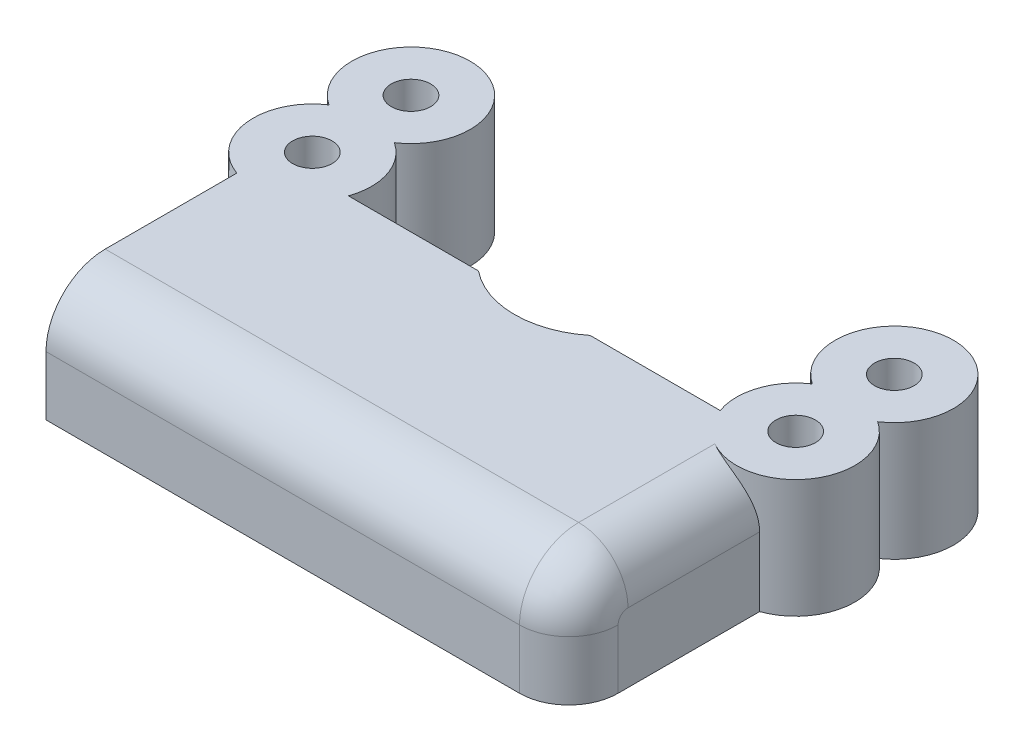
ISO-10303-21;
HEADER;
FILE_DESCRIPTION(('STEP AP214'),'2;1');
FILE_NAME('part.step','',(''),(''),'','','');
FILE_SCHEMA(('AUTOMOTIVE_DESIGN { 1 0 10303 214 1 1 1 1 }'));
ENDSEC;
DATA;
#1=APPLICATION_CONTEXT('core data for automotive mechanical design processes');
#2=APPLICATION_PROTOCOL_DEFINITION('international standard','automotive_design',2000,#1);
#3=PRODUCT_CONTEXT('',#1,'mechanical');
#4=PRODUCT('Part','Part','',(#3));
#5=PRODUCT_RELATED_PRODUCT_CATEGORY('part','',(#4));
#6=PRODUCT_DEFINITION_FORMATION('','',#4);
#7=PRODUCT_DEFINITION_CONTEXT('part definition',#1,'design');
#8=PRODUCT_DEFINITION('design','',#6,#7);
#9=PRODUCT_DEFINITION_SHAPE('','',#8);
#10=(LENGTH_UNIT() NAMED_UNIT(*) SI_UNIT(.MILLI.,.METRE.));
#11=(NAMED_UNIT(*) PLANE_ANGLE_UNIT() SI_UNIT($,.RADIAN.));
#12=(NAMED_UNIT(*) SI_UNIT($,.STERADIAN.) SOLID_ANGLE_UNIT());
#13=UNCERTAINTY_MEASURE_WITH_UNIT(LENGTH_MEASURE(1.E-05),#10,'distance_accuracy_value','');
#14=(GEOMETRIC_REPRESENTATION_CONTEXT(3) GLOBAL_UNCERTAINTY_ASSIGNED_CONTEXT((#13)) GLOBAL_UNIT_ASSIGNED_CONTEXT((#10,
#11,#12)) REPRESENTATION_CONTEXT('',''));
#15=CARTESIAN_POINT('',(0.,0.,0.));
#16=DIRECTION('',(0.,0.,1.));
#17=DIRECTION('',(1.,0.,0.));
#18=AXIS2_PLACEMENT_3D('',#15,#16,#17);
#19=CARTESIAN_POINT('',(-34.8608150974105,12.,-10.4858270670103));
#20=DIRECTION('',(0.,0.,1.));
#21=DIRECTION('',(1.,0.,0.));
#22=AXIS2_PLACEMENT_3D('',#19,#20,#21);
#23=PLANE('',#22);
#24=DIRECTION('',(-1.,0.,0.));
#25=VECTOR('',#24,1.);
#26=CARTESIAN_POINT('',(-34.8608150974105,10.,-10.4858270670103));
#27=LINE('',#26,#25);
#28=CARTESIAN_POINT('',(10.4823306530971,10.,-10.4858270670103));
#29=VERTEX_POINT('',#28);
#30=CARTESIAN_POINT('',(-2.70396084791812,10.,-10.4858270670103));
#31=VERTEX_POINT('',#30);
#32=EDGE_CURVE('E223',#29,#31,#27,.T.);
#33=ORIENTED_EDGE('',*,*,#32,.T.);
#34=DIRECTION('',(0.,1.,0.));
#35=VECTOR('',#34,1.);
#36=CARTESIAN_POINT('',(-2.70396084791812,10.,-10.4858270670103));
#37=LINE('',#36,#35);
#38=CARTESIAN_POINT('',(-2.70396084791812,12.,-10.4858270670103));
#39=VERTEX_POINT('',#38);
#40=EDGE_CURVE('E201',#31,#39,#37,.T.);
#41=ORIENTED_EDGE('',*,*,#40,.T.);
#42=DIRECTION('',(-1.,0.,0.));
#43=VECTOR('',#42,1.);
#44=CARTESIAN_POINT('',(-34.8608150974105,12.,-10.4858270670103));
#45=LINE('',#44,#43);
#46=CARTESIAN_POINT('',(10.4823306530971,12.,-10.4858270670103));
#47=VERTEX_POINT('',#46);
#48=EDGE_CURVE('E235',#47,#39,#45,.T.);
#49=ORIENTED_EDGE('',*,*,#48,.F.);
#50=DIRECTION('',(0.,-1.,0.));
#51=VECTOR('',#50,1.);
#52=CARTESIAN_POINT('',(10.4823306530971,12.,-10.4858270670103));
#53=LINE('',#52,#51);
#54=EDGE_CURVE('E359',#29,#47,#53,.F.);
#55=ORIENTED_EDGE('',*,*,#54,.F.);
#56=EDGE_LOOP('',(#33,#41,#49,#55));
#57=FACE_BOUND('',#56,.T.);
#58=ADVANCED_FACE('F67',(#57),#23,.F.);
#59=CARTESIAN_POINT('',(-14.0176693469029,12.,-10.4858270670103));
#60=VERTEX_POINT('',#59);
#61=CARTESIAN_POINT('',(-27.2039608479181,12.,-10.4858270670103));
#62=VERTEX_POINT('',#61);
#63=EDGE_CURVE('E215',#60,#62,#45,.T.);
#64=ORIENTED_EDGE('',*,*,#63,.F.);
#65=DIRECTION('',(0.,1.,0.));
#66=VECTOR('',#65,1.);
#67=CARTESIAN_POINT('',(-14.0176693469029,10.,-10.4858270670103));
#68=LINE('',#67,#66);
#69=CARTESIAN_POINT('',(-14.0176693469029,10.,-10.4858270670103));
#70=VERTEX_POINT('',#69);
#71=EDGE_CURVE('E198',#60,#70,#68,.F.);
#72=ORIENTED_EDGE('',*,*,#71,.T.);
#73=CARTESIAN_POINT('',(-27.2039608479181,10.,-10.4858270670103));
#74=VERTEX_POINT('',#73);
#75=EDGE_CURVE('E213',#70,#74,#27,.T.);
#76=ORIENTED_EDGE('',*,*,#75,.T.);
#77=DIRECTION('',(0.,-1.,0.));
#78=VECTOR('',#77,1.);
#79=CARTESIAN_POINT('',(-27.2039608479181,12.,-10.4858270670103));
#80=LINE('',#79,#78);
#81=EDGE_CURVE('E386',#62,#74,#80,.T.);
#82=ORIENTED_EDGE('',*,*,#81,.F.);
#83=EDGE_LOOP('',(#64,#72,#76,#82));
#84=FACE_BOUND('',#83,.T.);
#85=ADVANCED_FACE('F211',(#84),#23,.F.);
#86=CARTESIAN_POINT('',(18.1391849025895,12.,12.5141729329897));
#87=DIRECTION('',(-1.,0.,0.));
#88=DIRECTION('',(0.,0.,1.));
#89=AXIS2_PLACEMENT_3D('',#86,#87,#88);
#90=PLANE('',#89);
#91=CARTESIAN_POINT('',(18.1391849025895,6.,6.5141729329897));
#92=DIRECTION('',(-1.,0.,0.));
#93=DIRECTION('',(0.,0.,1.));
#94=AXIS2_PLACEMENT_3D('',#91,#92,#93);
#95=CIRCLE('',#94,1.);
#96=CARTESIAN_POINT('',(18.1391849025895,7.,6.5141729329897));
#97=VERTEX_POINT('',#96);
#98=CARTESIAN_POINT('',(18.1391849025895,6.,7.5141729329897));
#99=VERTEX_POINT('',#98);
#100=EDGE_CURVE('E263',#97,#99,#95,.F.);
#101=ORIENTED_EDGE('',*,*,#100,.T.);
#102=DIRECTION('',(0.,-1.,0.));
#103=VECTOR('',#102,1.);
#104=CARTESIAN_POINT('',(18.1391849025895,12.,7.5141729329897));
#105=LINE('',#104,#103);
#106=CARTESIAN_POINT('',(18.1391849025895,0.,7.5141729329897));
#107=VERTEX_POINT('',#106);
#108=EDGE_CURVE('E265',#99,#107,#105,.T.);
#109=ORIENTED_EDGE('',*,*,#108,.T.);
#110=DIRECTION('',(0.,0.,1.));
#111=VECTOR('',#110,1.);
#112=CARTESIAN_POINT('',(18.1391849025895,0.,0.));
#113=LINE('',#112,#111);
#114=CARTESIAN_POINT('',(18.1391849025895,0.,-6.82897281751792));
#115=VERTEX_POINT('',#114);
#116=EDGE_CURVE('E417',#115,#107,#113,.T.);
#117=ORIENTED_EDGE('',*,*,#116,.F.);
#118=DIRECTION('',(0.,-1.,0.));
#119=VECTOR('',#118,1.);
#120=CARTESIAN_POINT('',(18.1391849025895,10.,-6.82897281751792));
#121=LINE('',#120,#119);
#122=CARTESIAN_POINT('',(18.1391849025895,7.,-6.82897281751792));
#123=VERTEX_POINT('',#122);
#124=EDGE_CURVE('E433',#123,#115,#121,.T.);
#125=ORIENTED_EDGE('',*,*,#124,.F.);
#126=DIRECTION('',(0.,0.,-1.));
#127=VECTOR('',#126,1.);
#128=CARTESIAN_POINT('',(18.1391849025895,7.,12.5141729329897));
#129=LINE('',#128,#127);
#130=EDGE_CURVE('E206',#123,#97,#129,.F.);
#131=ORIENTED_EDGE('',*,*,#130,.T.);
#132=EDGE_LOOP('',(#101,#109,#117,#125,#131));
#133=FACE_BOUND('',#132,.T.);
#134=ADVANCED_FACE('F307',(#133),#90,.F.);
#135=CARTESIAN_POINT('',(-34.8608150974105,12.,12.5141729329897));
#136=DIRECTION('',(1.,0.,0.));
#137=DIRECTION('',(0.,0.,-1.));
#138=AXIS2_PLACEMENT_3D('',#135,#136,#137);
#139=PLANE('',#138);
#140=DIRECTION('',(0.,-1.,0.));
#141=VECTOR('',#140,1.);
#142=CARTESIAN_POINT('',(-34.8608150974105,12.,-6.82897281751793));
#143=LINE('',#142,#141);
#144=CARTESIAN_POINT('',(-34.8608150974105,10.,-6.82897281751793));
#145=VERTEX_POINT('',#144);
#146=CARTESIAN_POINT('',(-34.8608150974105,12.,-6.82897281751793));
#147=VERTEX_POINT('',#146);
#148=EDGE_CURVE('E390',#145,#147,#143,.F.);
#149=ORIENTED_EDGE('',*,*,#148,.F.);
#150=DIRECTION('',(0.,0.,1.));
#151=VECTOR('',#150,1.);
#152=CARTESIAN_POINT('',(-34.8608150974105,10.,12.5141729329897));
#153=LINE('',#152,#151);
#154=CARTESIAN_POINT('',(-34.8608150974105,10.,7.54581557448832));
#155=VERTEX_POINT('',#154);
#156=EDGE_CURVE('E224',#145,#155,#153,.T.);
#157=ORIENTED_EDGE('',*,*,#156,.T.);
#158=DIRECTION('',(0.,-1.,0.));
#159=VECTOR('',#158,1.);
#160=CARTESIAN_POINT('',(-34.8608150974105,10.,7.54581557448832));
#161=LINE('',#160,#159);
#162=CARTESIAN_POINT('',(-34.8608150974105,0.,7.54581557448832));
#163=VERTEX_POINT('',#162);
#164=EDGE_CURVE('E375',#155,#163,#161,.T.);
#165=ORIENTED_EDGE('',*,*,#164,.T.);
#166=DIRECTION('',(0.,0.,1.));
#167=VECTOR('',#166,1.);
#168=CARTESIAN_POINT('',(-34.8608150974105,0.,0.));
#169=LINE('',#168,#167);
#170=CARTESIAN_POINT('',(-34.8608150974105,0.,12.5141729329897));
#171=VERTEX_POINT('',#170);
#172=EDGE_CURVE('E411',#163,#171,#169,.T.);
#173=ORIENTED_EDGE('',*,*,#172,.T.);
#174=DIRECTION('',(0.,-1.,0.));
#175=VECTOR('',#174,1.);
#176=CARTESIAN_POINT('',(-34.8608150974105,12.,12.5141729329897));
#177=LINE('',#176,#175);
#178=CARTESIAN_POINT('',(-34.8608150974105,6.,12.5141729329897));
#179=VERTEX_POINT('',#178);
#180=EDGE_CURVE('E232',#179,#171,#177,.T.);
#181=ORIENTED_EDGE('',*,*,#180,.F.);
#182=CARTESIAN_POINT('',(-34.8608150974105,6.,6.5141729329897));
#183=DIRECTION('',(1.,0.,0.));
#184=DIRECTION('',(0.,0.,-1.));
#185=AXIS2_PLACEMENT_3D('',#182,#183,#184);
#186=CIRCLE('',#185,6.);
#187=CARTESIAN_POINT('',(-34.8608150974105,12.,6.5141729329897));
#188=VERTEX_POINT('',#187);
#189=EDGE_CURVE('E207',#179,#188,#186,.F.);
#190=ORIENTED_EDGE('',*,*,#189,.T.);
#191=DIRECTION('',(0.,0.,1.));
#192=VECTOR('',#191,1.);
#193=CARTESIAN_POINT('',(-34.8608150974105,12.,12.5141729329897));
#194=LINE('',#193,#192);
#195=EDGE_CURVE('E226',#147,#188,#194,.T.);
#196=ORIENTED_EDGE('',*,*,#195,.F.);
#197=EDGE_LOOP('',(#149,#157,#165,#173,#181,#190,#196));
#198=FACE_BOUND('',#197,.T.);
#199=ADVANCED_FACE('F310',(#198),#139,.F.);
#200=CARTESIAN_POINT('',(-32.8608150974105,10.,-22.4858270670103));
#201=DIRECTION('',(0.,-1.,0.));
#202=DIRECTION('',(0.,0.,-1.));
#203=AXIS2_PLACEMENT_3D('',#200,#201,#202);
#204=CYLINDRICAL_SURFACE('',#203,6.);
#205=CARTESIAN_POINT('',(-32.8608150974105,0.,-22.4858270670103));
#206=DIRECTION('',(0.,1.,0.));
#207=DIRECTION('',(0.,0.,1.));
#208=AXIS2_PLACEMENT_3D('',#205,#206,#207);
#209=CIRCLE('',#208,6.);
#210=CARTESIAN_POINT('',(-29.5441903070551,0.,-17.4858270670103));
#211=VERTEX_POINT('',#210);
#212=CARTESIAN_POINT('',(-36.1774398877659,0.,-17.4858270670103));
#213=VERTEX_POINT('',#212);
#214=EDGE_CURVE('E234',#211,#213,#209,.T.);
#215=ORIENTED_EDGE('',*,*,#214,.T.);
#216=DIRECTION('',(0.,-1.,0.));
#217=VECTOR('',#216,1.);
#218=CARTESIAN_POINT('',(-36.1774398877659,10.,-17.4858270670103));
#219=LINE('',#218,#217);
#220=CARTESIAN_POINT('',(-36.1774398877659,12.,-17.4858270670103));
#221=VERTEX_POINT('',#220);
#222=EDGE_CURVE('E250',#221,#213,#219,.T.);
#223=ORIENTED_EDGE('',*,*,#222,.F.);
#224=CARTESIAN_POINT('',(-32.8608150974105,12.,-22.4858270670103));
#225=DIRECTION('',(0.,1.,0.));
#226=DIRECTION('',(0.,0.,1.));
#227=AXIS2_PLACEMENT_3D('',#224,#225,#226);
#228=CIRCLE('',#227,6.);
#229=CARTESIAN_POINT('',(-29.5441903070551,12.,-17.4858270670103));
#230=VERTEX_POINT('',#229);
#231=EDGE_CURVE('E388',#230,#221,#228,.T.);
#232=ORIENTED_EDGE('',*,*,#231,.F.);
#233=DIRECTION('',(0.,-1.,0.));
#234=VECTOR('',#233,1.);
#235=CARTESIAN_POINT('',(-29.5441903070551,10.,-17.4858270670103));
#236=LINE('',#235,#234);
#237=EDGE_CURVE('E237',#230,#211,#236,.T.);
#238=ORIENTED_EDGE('',*,*,#237,.T.);
#239=EDGE_LOOP('',(#215,#223,#232,#238));
#240=FACE_BOUND('',#239,.T.);
#241=ADVANCED_FACE('F318',(#240),#204,.T.);
#242=CARTESIAN_POINT('',(-32.8608150974105,10.,-22.4858270670103));
#243=DIRECTION('',(0.,-1.,0.));
#244=DIRECTION('',(0.,0.,-1.));
#245=AXIS2_PLACEMENT_3D('',#242,#243,#244);
#246=CYLINDRICAL_SURFACE('',#245,2.);
#247=CARTESIAN_POINT('',(-32.8608150974105,0.,-22.4858270670103));
#248=DIRECTION('',(0.,1.,0.));
#249=DIRECTION('',(0.,0.,1.));
#250=AXIS2_PLACEMENT_3D('',#247,#248,#249);
#251=CIRCLE('',#250,2.);
#252=CARTESIAN_POINT('',(-32.8608150974105,0.,-20.4858270670103));
#253=VERTEX_POINT('',#252);
#254=EDGE_CURVE('E243',#253,#253,#251,.T.);
#255=ORIENTED_EDGE('',*,*,#254,.F.);
#256=EDGE_LOOP('',(#255));
#257=FACE_BOUND('',#256,.T.);
#258=CARTESIAN_POINT('',(-32.8608150974105,12.,-22.4858270670103));
#259=DIRECTION('',(0.,1.,0.));
#260=DIRECTION('',(0.,0.,1.));
#261=AXIS2_PLACEMENT_3D('',#258,#259,#260);
#262=CIRCLE('',#261,2.00000000000001);
#263=CARTESIAN_POINT('',(-32.8608150974105,12.,-20.4858270670103));
#264=VERTEX_POINT('',#263);
#265=EDGE_CURVE('E395',#264,#264,#262,.T.);
#266=ORIENTED_EDGE('',*,*,#265,.T.);
#267=EDGE_LOOP('',(#266));
#268=FACE_BOUND('',#267,.T.);
#269=ADVANCED_FACE('F328',(#257,#268),#246,.F.);
#270=CARTESIAN_POINT('',(-32.8608150974105,10.,-12.4858270670103));
#271=DIRECTION('',(0.,-1.,0.));
#272=DIRECTION('',(0.,0.,-1.));
#273=AXIS2_PLACEMENT_3D('',#270,#271,#272);
#274=CYLINDRICAL_SURFACE('',#273,6.);
#275=CARTESIAN_POINT('',(-32.8608150974105,0.,-12.4858270670103));
#276=DIRECTION('',(0.,1.,0.));
#277=DIRECTION('',(0.,0.,1.));
#278=AXIS2_PLACEMENT_3D('',#275,#276,#277);
#279=CIRCLE('',#278,6.);
#280=EDGE_CURVE('E241',#213,#211,#279,.T.);
#281=ORIENTED_EDGE('',*,*,#280,.T.);
#282=ORIENTED_EDGE('',*,*,#237,.F.);
#283=CARTESIAN_POINT('',(-32.8608150974105,12.,-12.4858270670103));
#284=DIRECTION('',(0.,1.,0.));
#285=DIRECTION('',(0.,0.,1.));
#286=AXIS2_PLACEMENT_3D('',#283,#284,#285);
#287=CIRCLE('',#286,5.99999999999999);
#288=EDGE_CURVE('E384',#62,#230,#287,.T.);
#289=ORIENTED_EDGE('',*,*,#288,.F.);
#290=ORIENTED_EDGE('',*,*,#81,.T.);
#291=CARTESIAN_POINT('',(-32.8608150974105,10.,-12.4858270670103));
#292=DIRECTION('',(0.,1.,0.));
#293=DIRECTION('',(0.,0.,1.));
#294=AXIS2_PLACEMENT_3D('',#291,#292,#293);
#295=CIRCLE('',#294,6.);
#296=EDGE_CURVE('E222',#145,#74,#295,.T.);
#297=ORIENTED_EDGE('',*,*,#296,.F.);
#298=ORIENTED_EDGE('',*,*,#148,.T.);
#299=EDGE_CURVE('E387',#221,#147,#287,.T.);
#300=ORIENTED_EDGE('',*,*,#299,.F.);
#301=ORIENTED_EDGE('',*,*,#222,.T.);
#302=EDGE_LOOP('',(#281,#282,#289,#290,#297,#298,#300,#301));
#303=FACE_BOUND('',#302,.T.);
#304=ADVANCED_FACE('F326',(#303),#274,.T.);
#305=CARTESIAN_POINT('',(-32.8608150974105,10.,-12.4858270670103));
#306=DIRECTION('',(0.,-1.,0.));
#307=DIRECTION('',(0.,0.,-1.));
#308=AXIS2_PLACEMENT_3D('',#305,#306,#307);
#309=CYLINDRICAL_SURFACE('',#308,2.);
#310=CARTESIAN_POINT('',(-32.8608150974105,0.,-12.4858270670103));
#311=DIRECTION('',(0.,1.,0.));
#312=DIRECTION('',(0.,0.,1.));
#313=AXIS2_PLACEMENT_3D('',#310,#311,#312);
#314=CIRCLE('',#313,2.);
#315=CARTESIAN_POINT('',(-32.8608150974105,0.,-10.4858270670103));
#316=VERTEX_POINT('',#315);
#317=EDGE_CURVE('E238',#316,#316,#314,.T.);
#318=ORIENTED_EDGE('',*,*,#317,.F.);
#319=EDGE_LOOP('',(#318));
#320=FACE_BOUND('',#319,.T.);
#321=CARTESIAN_POINT('',(-32.8608150974105,12.,-12.4858270670103));
#322=DIRECTION('',(0.,1.,0.));
#323=DIRECTION('',(0.,0.,1.));
#324=AXIS2_PLACEMENT_3D('',#321,#322,#323);
#325=CIRCLE('',#324,2.);
#326=CARTESIAN_POINT('',(-32.8608150974105,12.,-10.4858270670103));
#327=VERTEX_POINT('',#326);
#328=EDGE_CURVE('E391',#327,#327,#325,.T.);
#329=ORIENTED_EDGE('',*,*,#328,.T.);
#330=EDGE_LOOP('',(#329));
#331=FACE_BOUND('',#330,.T.);
#332=ADVANCED_FACE('F322',(#320,#331),#309,.F.);
#333=CARTESIAN_POINT('',(0.,0.,0.));
#334=DIRECTION('',(0.,1.,0.));
#335=DIRECTION('',(0.,0.,1.));
#336=AXIS2_PLACEMENT_3D('',#333,#334,#335);
#337=PLANE('',#336);
#338=ORIENTED_EDGE('',*,*,#214,.F.);
#339=ORIENTED_EDGE('',*,*,#280,.F.);
#340=EDGE_LOOP('',(#338,#339));
#341=FACE_BOUND('',#340,.T.);
#342=ORIENTED_EDGE('',*,*,#254,.T.);
#343=EDGE_LOOP('',(#342));
#344=FACE_BOUND('',#343,.T.);
#345=ORIENTED_EDGE('',*,*,#317,.T.);
#346=EDGE_LOOP('',(#345));
#347=FACE_BOUND('',#346,.T.);
#348=ADVANCED_FACE('F314',(#341,#344,#347),#337,.F.);
#349=CARTESIAN_POINT('',(-34.8608150974105,12.,12.5141729329897));
#350=DIRECTION('',(0.,0.,-1.));
#351=DIRECTION('',(-1.,0.,0.));
#352=AXIS2_PLACEMENT_3D('',#349,#350,#351);
#353=PLANE('',#352);
#354=DIRECTION('',(1.,0.,0.));
#355=VECTOR('',#354,1.);
#356=CARTESIAN_POINT('',(0.,0.,12.5141729329897));
#357=LINE('',#356,#355);
#358=CARTESIAN_POINT('',(13.1391849025895,0.,12.5141729329897));
#359=VERTEX_POINT('',#358);
#360=EDGE_CURVE('E414',#171,#359,#357,.T.);
#361=ORIENTED_EDGE('',*,*,#360,.T.);
#362=DIRECTION('',(0.,-1.,0.));
#363=VECTOR('',#362,1.);
#364=CARTESIAN_POINT('',(13.1391849025895,12.,12.5141729329897));
#365=LINE('',#364,#363);
#366=CARTESIAN_POINT('',(13.1391849025895,6.,12.5141729329897));
#367=VERTEX_POINT('',#366);
#368=EDGE_CURVE('E270',#359,#367,#365,.F.);
#369=ORIENTED_EDGE('',*,*,#368,.T.);
#370=DIRECTION('',(1.,0.,0.));
#371=VECTOR('',#370,1.);
#372=CARTESIAN_POINT('',(-34.8608150974105,6.,12.5141729329897));
#373=LINE('',#372,#371);
#374=EDGE_CURVE('E258',#367,#179,#373,.F.);
#375=ORIENTED_EDGE('',*,*,#374,.T.);
#376=ORIENTED_EDGE('',*,*,#180,.T.);
#377=EDGE_LOOP('',(#361,#369,#375,#376));
#378=FACE_BOUND('',#377,.T.);
#379=ADVANCED_FACE('F301',(#378),#353,.F.);
#380=CARTESIAN_POINT('',(0.,12.,0.));
#381=DIRECTION('',(0.,-1.,0.));
#382=DIRECTION('',(0.,0.,-1.));
#383=AXIS2_PLACEMENT_3D('',#380,#381,#382);
#384=PLANE('',#383);
#385=CARTESIAN_POINT('',(16.1391849025895,12.,-12.4858270670103));
#386=DIRECTION('',(0.,1.,0.));
#387=DIRECTION('',(0.,0.,1.));
#388=AXIS2_PLACEMENT_3D('',#385,#386,#387);
#389=CIRCLE('',#388,2.);
#390=CARTESIAN_POINT('',(16.1391849025895,12.,-10.4858270670103));
#391=VERTEX_POINT('',#390);
#392=EDGE_CURVE('E450',#391,#391,#389,.F.);
#393=ORIENTED_EDGE('',*,*,#392,.T.);
#394=EDGE_LOOP('',(#393));
#395=FACE_BOUND('',#394,.T.);
#396=DIRECTION('',(1.,0.,0.));
#397=VECTOR('',#396,1.);
#398=CARTESIAN_POINT('',(0.,12.,6.5141729329897));
#399=LINE('',#398,#397);
#400=CARTESIAN_POINT('',(13.1391849025895,12.,6.5141729329897));
#401=VERTEX_POINT('',#400);
#402=EDGE_CURVE('E256',#188,#401,#399,.T.);
#403=ORIENTED_EDGE('',*,*,#402,.T.);
#404=DIRECTION('',(0.,0.,-1.));
#405=VECTOR('',#404,1.);
#406=CARTESIAN_POINT('',(13.1391849025895,12.,0.));
#407=LINE('',#406,#405);
#408=CARTESIAN_POINT('',(13.1391849025895,12.,-7.28967464430367));
#409=VERTEX_POINT('',#408);
#410=EDGE_CURVE('E77',#401,#409,#407,.T.);
#411=ORIENTED_EDGE('',*,*,#410,.T.);
#412=CARTESIAN_POINT('',(16.1391849025895,12.,-12.4858270670103));
#413=DIRECTION('',(0.,1.,0.));
#414=DIRECTION('',(0.,0.,1.));
#415=AXIS2_PLACEMENT_3D('',#412,#413,#414);
#416=CIRCLE('',#415,6.);
#417=CARTESIAN_POINT('',(19.4558096929449,12.,-17.4858270670103));
#418=VERTEX_POINT('',#417);
#419=EDGE_CURVE('E84',#409,#418,#416,.T.);
#420=ORIENTED_EDGE('',*,*,#419,.T.);
#421=CARTESIAN_POINT('',(16.1391849025895,12.,-22.4858270670103));
#422=DIRECTION('',(0.,1.,0.));
#423=DIRECTION('',(0.,0.,1.));
#424=AXIS2_PLACEMENT_3D('',#421,#422,#423);
#425=CIRCLE('',#424,6.);
#426=CARTESIAN_POINT('',(12.8225601122341,12.,-17.4858270670103));
#427=VERTEX_POINT('',#426);
#428=EDGE_CURVE('E449',#418,#427,#425,.T.);
#429=ORIENTED_EDGE('',*,*,#428,.T.);
#430=EDGE_CURVE('E445',#427,#47,#416,.T.);
#431=ORIENTED_EDGE('',*,*,#430,.T.);
#432=ORIENTED_EDGE('',*,*,#48,.T.);
#433=CARTESIAN_POINT('',(-8.36081509741049,12.,-17.4858270670103));
#434=DIRECTION('',(0.,1.,0.));
#435=DIRECTION('',(0.,0.,1.));
#436=AXIS2_PLACEMENT_3D('',#433,#434,#435);
#437=CIRCLE('',#436,9.);
#438=EDGE_CURVE('E216',#60,#39,#437,.T.);
#439=ORIENTED_EDGE('',*,*,#438,.F.);
#440=ORIENTED_EDGE('',*,*,#63,.T.);
#441=ORIENTED_EDGE('',*,*,#288,.T.);
#442=ORIENTED_EDGE('',*,*,#231,.T.);
#443=ORIENTED_EDGE('',*,*,#299,.T.);
#444=ORIENTED_EDGE('',*,*,#195,.T.);
#445=EDGE_LOOP('',(#403,#411,#420,#429,#431,#432,#439,#440,#441,#442,#443,#444));
#446=FACE_BOUND('',#445,.T.);
#447=ORIENTED_EDGE('',*,*,#265,.F.);
#448=EDGE_LOOP('',(#447));
#449=FACE_BOUND('',#448,.T.);
#450=ORIENTED_EDGE('',*,*,#328,.F.);
#451=EDGE_LOOP('',(#450));
#452=FACE_BOUND('',#451,.T.);
#453=CARTESIAN_POINT('',(16.1391849025895,12.,-22.4858270670103));
#454=DIRECTION('',(0.,1.,0.));
#455=DIRECTION('',(0.,0.,1.));
#456=AXIS2_PLACEMENT_3D('',#453,#454,#455);
#457=CIRCLE('',#456,2.);
#458=CARTESIAN_POINT('',(16.1391849025895,12.,-20.4858270670103));
#459=VERTEX_POINT('',#458);
#460=EDGE_CURVE('E447',#459,#459,#457,.F.);
#461=ORIENTED_EDGE('',*,*,#460,.T.);
#462=EDGE_LOOP('',(#461));
#463=FACE_BOUND('',#462,.T.);
#464=ADVANCED_FACE('F298',(#395,#446,#449,#452,#463),#384,.F.);
#465=CARTESIAN_POINT('',(0.,10.,0.));
#466=DIRECTION('',(0.,-1.,0.));
#467=DIRECTION('',(0.,0.,-1.));
#468=AXIS2_PLACEMENT_3D('',#465,#466,#467);
#469=PLANE('',#468);
#470=CARTESIAN_POINT('',(-8.36081509741049,10.,-17.4858270670103));
#471=DIRECTION('',(0.,-1.,0.));
#472=DIRECTION('',(0.,0.,-1.));
#473=AXIS2_PLACEMENT_3D('',#470,#471,#472);
#474=CIRCLE('',#473,9.);
#475=EDGE_CURVE('E195',#31,#70,#474,.T.);
#476=ORIENTED_EDGE('',*,*,#475,.F.);
#477=ORIENTED_EDGE('',*,*,#32,.F.);
#478=CARTESIAN_POINT('',(16.1391849025895,10.,-12.4858270670103));
#479=DIRECTION('',(0.,-1.,0.));
#480=DIRECTION('',(0.,0.,-1.));
#481=AXIS2_PLACEMENT_3D('',#478,#479,#480);
#482=CIRCLE('',#481,6.);
#483=CARTESIAN_POINT('',(14.1391849025895,10.,-6.82897281751792));
#484=VERTEX_POINT('',#483);
#485=EDGE_CURVE('E253',#29,#484,#482,.F.);
#486=ORIENTED_EDGE('',*,*,#485,.T.);
#487=DIRECTION('',(0.,0.,1.));
#488=VECTOR('',#487,1.);
#489=CARTESIAN_POINT('',(14.1391849025895,10.,0.));
#490=LINE('',#489,#488);
#491=CARTESIAN_POINT('',(14.1391849025895,10.,7.5458155744883));
#492=VERTEX_POINT('',#491);
#493=EDGE_CURVE('E363',#484,#492,#490,.T.);
#494=ORIENTED_EDGE('',*,*,#493,.T.);
#495=DIRECTION('',(1.,0.,0.));
#496=VECTOR('',#495,1.);
#497=CARTESIAN_POINT('',(0.,10.,7.54581557448831));
#498=LINE('',#497,#496);
#499=EDGE_CURVE('E400',#155,#492,#498,.T.);
#500=ORIENTED_EDGE('',*,*,#499,.F.);
#501=ORIENTED_EDGE('',*,*,#156,.F.);
#502=ORIENTED_EDGE('',*,*,#296,.T.);
#503=ORIENTED_EDGE('',*,*,#75,.F.);
#504=EDGE_LOOP('',(#476,#477,#486,#494,#500,#501,#502,#503));
#505=FACE_BOUND('',#504,.T.);
#506=ADVANCED_FACE('F219',(#505),#469,.T.);
#507=CARTESIAN_POINT('',(16.1391849025895,10.,-12.4858270670103));
#508=DIRECTION('',(0.,-1.,0.));
#509=DIRECTION('',(0.,0.,-1.));
#510=AXIS2_PLACEMENT_3D('',#507,#508,#509);
#511=CYLINDRICAL_SURFACE('',#510,6.);
#512=CARTESIAN_POINT('',(16.1391849025895,0.,-12.4858270670103));
#513=DIRECTION('',(0.,1.,0.));
#514=DIRECTION('',(0.,0.,1.));
#515=AXIS2_PLACEMENT_3D('',#512,#513,#514);
#516=CIRCLE('',#515,6.);
#517=CARTESIAN_POINT('',(12.8225601122341,0.,-17.4858270670103));
#518=VERTEX_POINT('',#517);
#519=CARTESIAN_POINT('',(14.1391849025895,0.,-6.82897281751792));
#520=VERTEX_POINT('',#519);
#521=EDGE_CURVE('E371',#518,#520,#516,.T.);
#522=ORIENTED_EDGE('',*,*,#521,.T.);
#523=DIRECTION('',(0.,-1.,0.));
#524=VECTOR('',#523,1.);
#525=CARTESIAN_POINT('',(14.1391849025895,10.,-6.82897281751792));
#526=LINE('',#525,#524);
#527=EDGE_CURVE('E228',#484,#520,#526,.T.);
#528=ORIENTED_EDGE('',*,*,#527,.F.);
#529=ORIENTED_EDGE('',*,*,#485,.F.);
#530=ORIENTED_EDGE('',*,*,#54,.T.);
#531=ORIENTED_EDGE('',*,*,#430,.F.);
#532=DIRECTION('',(0.,-1.,0.));
#533=VECTOR('',#532,1.);
#534=CARTESIAN_POINT('',(12.8225601122341,10.,-17.4858270670103));
#535=LINE('',#534,#533);
#536=EDGE_CURVE('E404',#427,#518,#535,.T.);
#537=ORIENTED_EDGE('',*,*,#536,.T.);
#538=EDGE_LOOP('',(#522,#528,#529,#530,#531,#537));
#539=FACE_BOUND('',#538,.T.);
#540=ADVANCED_FACE('F293',(#539),#511,.T.);
#541=CARTESIAN_POINT('',(14.1391849025895,10.,0.));
#542=DIRECTION('',(1.,0.,0.));
#543=DIRECTION('',(0.,0.,-1.));
#544=AXIS2_PLACEMENT_3D('',#541,#542,#543);
#545=PLANE('',#544);
#546=DIRECTION('',(0.,0.,1.));
#547=VECTOR('',#546,1.);
#548=CARTESIAN_POINT('',(14.1391849025895,0.,0.));
#549=LINE('',#548,#547);
#550=CARTESIAN_POINT('',(14.1391849025895,0.,7.5458155744883));
#551=VERTEX_POINT('',#550);
#552=EDGE_CURVE('E406',#520,#551,#549,.T.);
#553=ORIENTED_EDGE('',*,*,#552,.T.);
#554=DIRECTION('',(0.,-1.,0.));
#555=VECTOR('',#554,1.);
#556=CARTESIAN_POINT('',(14.1391849025895,10.,7.5458155744883));
#557=LINE('',#556,#555);
#558=EDGE_CURVE('E373',#492,#551,#557,.T.);
#559=ORIENTED_EDGE('',*,*,#558,.F.);
#560=ORIENTED_EDGE('',*,*,#493,.F.);
#561=ORIENTED_EDGE('',*,*,#527,.T.);
#562=EDGE_LOOP('',(#553,#559,#560,#561));
#563=FACE_BOUND('',#562,.T.);
#564=ADVANCED_FACE('F289',(#563),#545,.F.);
#565=CARTESIAN_POINT('',(0.,10.,7.54581557448831));
#566=DIRECTION('',(0.,0.,-1.));
#567=DIRECTION('',(-1.,0.,0.));
#568=AXIS2_PLACEMENT_3D('',#565,#566,#567);
#569=PLANE('',#568);
#570=DIRECTION('',(1.,0.,0.));
#571=VECTOR('',#570,1.);
#572=CARTESIAN_POINT('',(0.,0.,7.54581557448831));
#573=LINE('',#572,#571);
#574=EDGE_CURVE('E408',#163,#551,#573,.T.);
#575=ORIENTED_EDGE('',*,*,#574,.F.);
#576=ORIENTED_EDGE('',*,*,#164,.F.);
#577=ORIENTED_EDGE('',*,*,#499,.T.);
#578=ORIENTED_EDGE('',*,*,#558,.T.);
#579=EDGE_LOOP('',(#575,#576,#577,#578));
#580=FACE_BOUND('',#579,.T.);
#581=ADVANCED_FACE('F284',(#580),#569,.T.);
#582=CARTESIAN_POINT('',(16.1391849025895,10.,-12.4858270670103));
#583=DIRECTION('',(0.,-1.,0.));
#584=DIRECTION('',(0.,0.,-1.));
#585=AXIS2_PLACEMENT_3D('',#582,#583,#584);
#586=CYLINDRICAL_SURFACE('',#585,6.);
#587=CARTESIAN_POINT('',(16.1391849025895,0.,-12.4858270670103));
#588=DIRECTION('',(0.,1.,0.));
#589=DIRECTION('',(0.,0.,1.));
#590=AXIS2_PLACEMENT_3D('',#587,#588,#589);
#591=CIRCLE('',#590,6.);
#592=CARTESIAN_POINT('',(19.4558096929449,0.,-17.4858270670103));
#593=VERTEX_POINT('',#592);
#594=EDGE_CURVE('E420',#115,#593,#591,.T.);
#595=ORIENTED_EDGE('',*,*,#594,.T.);
#596=DIRECTION('',(0.,-1.,0.));
#597=VECTOR('',#596,1.);
#598=CARTESIAN_POINT('',(19.4558096929449,10.,-17.4858270670103));
#599=LINE('',#598,#597);
#600=EDGE_CURVE('E430',#418,#593,#599,.T.);
#601=ORIENTED_EDGE('',*,*,#600,.F.);
#602=ORIENTED_EDGE('',*,*,#419,.F.);
#603=CARTESIAN_POINT('',(13.1391849025895,12.,-7.28967464430367));
#604=CARTESIAN_POINT('',(13.2391535505223,12.0000160297566,-7.23193309222189));
#605=CARTESIAN_POINT('',(13.3408339179892,11.9970020611581,-7.17709908401648));
#606=CARTESIAN_POINT('',(13.5468973864937,11.9844145994774,-7.07350022793511));
#607=CARTESIAN_POINT('',(13.6512816543022,11.9748382276792,-7.0247380546762));
#608=CARTESIAN_POINT('',(13.8618067639116,11.9486425097004,-6.93364711486172));
#609=CARTESIAN_POINT('',(13.967945156976,11.9320322964591,-6.89131010218625));
#610=CARTESIAN_POINT('',(14.1811869559775,11.8914216985392,-6.81316177166825));
#611=CARTESIAN_POINT('',(14.2882901758853,11.8674227100958,-6.77734922295027));
#612=CARTESIAN_POINT('',(14.5028534128177,11.8117284939499,-6.71217734487525));
#613=CARTESIAN_POINT('',(14.6103134918948,11.7800092819689,-6.68283868014611));
#614=CARTESIAN_POINT('',(14.8242503817054,11.7088493955975,-6.63065231278017));
#615=CARTESIAN_POINT('',(14.9307271703725,11.6694085483629,-6.60780475547112));
#616=CARTESIAN_POINT('',(15.1416302950381,11.5829240030345,-6.56836254835044));
#617=CARTESIAN_POINT('',(15.2460581524814,11.5358862057871,-6.55176307846979));
#618=CARTESIAN_POINT('',(15.4520291526218,11.4344034896902,-6.52440000977231));
#619=CARTESIAN_POINT('',(15.5535723554666,11.3799587254198,-6.51363628919008));
#620=CARTESIAN_POINT('',(15.7506246800427,11.2653329470982,-6.49762517079792));
#621=CARTESIAN_POINT('',(15.8462194197534,11.2053161120692,-6.4922545007239));
#622=CARTESIAN_POINT('',(16.033238635304,11.0788742786465,-6.48603190677072));
#623=CARTESIAN_POINT('',(16.1246617514672,11.0124472126018,-6.48518144590066));
#624=CARTESIAN_POINT('',(16.39186714236,10.8040759493726,-6.48850761326949));
#625=CARTESIAN_POINT('',(16.5606071517708,10.6530290589681,-6.498560309347));
#626=CARTESIAN_POINT('',(16.8920322363888,10.3133496628876,-6.53067448037203));
#627=CARTESIAN_POINT('',(17.0522482123461,10.1224398552414,-6.55387957714287));
#628=CARTESIAN_POINT('',(17.342418310274,9.71928313925638,-6.6058615767531));
#629=CARTESIAN_POINT('',(17.4723502013353,9.50702071902174,-6.63464254451942));
#630=CARTESIAN_POINT('',(17.6494754319682,9.16256957071761,-6.67864931034455));
#631=CARTESIAN_POINT('',(17.707959554501,9.0361048230842,-6.69428255748964));
#632=CARTESIAN_POINT('',(17.8142191947608,8.77860305820858,-6.72411647095109));
#633=CARTESIAN_POINT('',(17.8619981872444,8.64756754058985,-6.73831760128992));
#634=CARTESIAN_POINT('',(17.9464475065295,8.38189669737475,-6.76431023509728));
#635=CARTESIAN_POINT('',(17.9831300840745,8.24726552158621,-6.77610439121398));
#636=CARTESIAN_POINT('',(18.0451378713101,7.97522993843029,-6.79650312169036));
#637=CARTESIAN_POINT('',(18.0704686013671,7.83782691305121,-6.80510924602566));
#638=CARTESIAN_POINT('',(18.1063719204124,7.58371972404525,-6.81745098597843));
#639=CARTESIAN_POINT('',(18.1186749763164,7.46728455470911,-6.82175117191244));
#640=CARTESIAN_POINT('',(18.1350812840088,7.2339037472029,-6.82752235233867));
#641=CARTESIAN_POINT('',(18.139193940065,7.11695884917799,-6.82899659152748));
#642=CARTESIAN_POINT('',(18.1391849025895,7.,-6.82897281751792));
#643=B_SPLINE_CURVE_WITH_KNOTS('',3,(#603,#604,#605,#606,#607,#608,#609,#610,#611,#612,#613,
#614,#615,#616,#617,#618,#619,#620,#621,#622,#623,#624,#625,#626,#627,#628,#629,#630,#631,#632,
#633,#634,#635,#636,#637,#638,#639,#640,#641,#642),.UNSPECIFIED.,.F.,.F.,(4,2,2,2,2,2,2,2,2,2,2,
2,2,2,2,2,2,2,2,4),(0.,0.346292207689105,0.69273641999599,1.03873217196112,1.38466258220882,
1.73168172211801,2.07870863073818,2.42546727507763,2.77221868387053,3.11085029217747,
3.44959149518392,4.12699927646604,4.87509242560363,5.62373301665179,6.04393952168876,
6.46400943451274,6.8836138717546,7.30301403471211,7.65418715832866,8.00495682977338),.UNSPECIFIED.);
#644=EDGE_CURVE('E12',#409,#123,#643,.T.);
#645=ORIENTED_EDGE('',*,*,#644,.T.);
#646=ORIENTED_EDGE('',*,*,#124,.T.);
#647=EDGE_LOOP('',(#595,#601,#602,#645,#646));
#648=FACE_BOUND('',#647,.T.);
#649=ADVANCED_FACE('F278',(#648),#586,.T.);
#650=CARTESIAN_POINT('',(16.1391849025895,10.,-12.4858270670103));
#651=DIRECTION('',(0.,-1.,0.));
#652=DIRECTION('',(0.,0.,-1.));
#653=AXIS2_PLACEMENT_3D('',#650,#651,#652);
#654=CYLINDRICAL_SURFACE('',#653,2.);
#655=ORIENTED_EDGE('',*,*,#392,.F.);
#656=EDGE_LOOP('',(#655));
#657=FACE_BOUND('',#656,.T.);
#658=CARTESIAN_POINT('',(16.1391849025895,0.,-12.4858270670103));
#659=DIRECTION('',(0.,1.,0.));
#660=DIRECTION('',(0.,0.,1.));
#661=AXIS2_PLACEMENT_3D('',#658,#659,#660);
#662=CIRCLE('',#661,2.);
#663=CARTESIAN_POINT('',(16.1391849025895,0.,-10.4858270670103));
#664=VERTEX_POINT('',#663);
#665=EDGE_CURVE('E424',#664,#664,#662,.T.);
#666=ORIENTED_EDGE('',*,*,#665,.F.);
#667=EDGE_LOOP('',(#666));
#668=FACE_BOUND('',#667,.T.);
#669=ADVANCED_FACE('F283',(#657,#668),#654,.F.);
#670=CARTESIAN_POINT('',(16.1391849025895,10.,-22.4858270670103));
#671=DIRECTION('',(0.,-1.,0.));
#672=DIRECTION('',(0.,0.,-1.));
#673=AXIS2_PLACEMENT_3D('',#670,#671,#672);
#674=CYLINDRICAL_SURFACE('',#673,6.);
#675=CARTESIAN_POINT('',(16.1391849025895,0.,-22.4858270670103));
#676=DIRECTION('',(0.,1.,0.));
#677=DIRECTION('',(0.,0.,1.));
#678=AXIS2_PLACEMENT_3D('',#675,#676,#677);
#679=CIRCLE('',#678,6.);
#680=EDGE_CURVE('E422',#593,#518,#679,.T.);
#681=ORIENTED_EDGE('',*,*,#680,.T.);
#682=ORIENTED_EDGE('',*,*,#536,.F.);
#683=ORIENTED_EDGE('',*,*,#428,.F.);
#684=ORIENTED_EDGE('',*,*,#600,.T.);
#685=EDGE_LOOP('',(#681,#682,#683,#684));
#686=FACE_BOUND('',#685,.T.);
#687=ADVANCED_FACE('F285',(#686),#674,.T.);
#688=CARTESIAN_POINT('',(16.1391849025895,10.,-22.4858270670103));
#689=DIRECTION('',(0.,-1.,0.));
#690=DIRECTION('',(0.,0.,-1.));
#691=AXIS2_PLACEMENT_3D('',#688,#689,#690);
#692=CYLINDRICAL_SURFACE('',#691,2.);
#693=CARTESIAN_POINT('',(16.1391849025895,0.,-22.4858270670103));
#694=DIRECTION('',(0.,1.,0.));
#695=DIRECTION('',(0.,0.,1.));
#696=AXIS2_PLACEMENT_3D('',#693,#694,#695);
#697=CIRCLE('',#696,2.);
#698=CARTESIAN_POINT('',(16.1391849025895,0.,-20.4858270670103));
#699=VERTEX_POINT('',#698);
#700=EDGE_CURVE('E401',#699,#699,#697,.T.);
#701=ORIENTED_EDGE('',*,*,#700,.F.);
#702=EDGE_LOOP('',(#701));
#703=FACE_BOUND('',#702,.T.);
#704=ORIENTED_EDGE('',*,*,#460,.F.);
#705=EDGE_LOOP('',(#704));
#706=FACE_BOUND('',#705,.T.);
#707=ADVANCED_FACE('F468',(#703,#706),#692,.F.);
#708=CARTESIAN_POINT('',(0.,0.,0.));
#709=DIRECTION('',(0.,1.,0.));
#710=DIRECTION('',(0.,0.,1.));
#711=AXIS2_PLACEMENT_3D('',#708,#709,#710);
#712=PLANE('',#711);
#713=ORIENTED_EDGE('',*,*,#116,.T.);
#714=CARTESIAN_POINT('',(13.1391849025895,0.,7.5141729329897));
#715=DIRECTION('',(0.,1.,0.));
#716=DIRECTION('',(0.,0.,1.));
#717=AXIS2_PLACEMENT_3D('',#714,#715,#716);
#718=CIRCLE('',#717,5.);
#719=EDGE_CURVE('E268',#107,#359,#718,.F.);
#720=ORIENTED_EDGE('',*,*,#719,.T.);
#721=ORIENTED_EDGE('',*,*,#360,.F.);
#722=ORIENTED_EDGE('',*,*,#172,.F.);
#723=ORIENTED_EDGE('',*,*,#574,.T.);
#724=ORIENTED_EDGE('',*,*,#552,.F.);
#725=ORIENTED_EDGE('',*,*,#521,.F.);
#726=ORIENTED_EDGE('',*,*,#680,.F.);
#727=ORIENTED_EDGE('',*,*,#594,.F.);
#728=EDGE_LOOP('',(#713,#720,#721,#722,#723,#724,#725,#726,#727));
#729=FACE_BOUND('',#728,.T.);
#730=ORIENTED_EDGE('',*,*,#665,.T.);
#731=EDGE_LOOP('',(#730));
#732=FACE_BOUND('',#731,.T.);
#733=ORIENTED_EDGE('',*,*,#700,.T.);
#734=EDGE_LOOP('',(#733));
#735=FACE_BOUND('',#734,.T.);
#736=ADVANCED_FACE('F341',(#729,#732,#735),#712,.F.);
#737=CARTESIAN_POINT('',(0.,6.,6.5141729329897));
#738=DIRECTION('',(1.,0.,0.));
#739=DIRECTION('',(0.,0.,-1.));
#740=AXIS2_PLACEMENT_3D('',#737,#738,#739);
#741=CYLINDRICAL_SURFACE('',#740,6.);
#742=ORIENTED_EDGE('',*,*,#374,.F.);
#743=CARTESIAN_POINT('',(13.1391849025895,6.,6.5141729329897));
#744=DIRECTION('',(-1.,0.,0.));
#745=DIRECTION('',(0.,0.,1.));
#746=AXIS2_PLACEMENT_3D('',#743,#744,#745);
#747=CIRCLE('',#746,6.);
#748=EDGE_CURVE('E92',#367,#401,#747,.T.);
#749=ORIENTED_EDGE('',*,*,#748,.T.);
#750=ORIENTED_EDGE('',*,*,#402,.F.);
#751=ORIENTED_EDGE('',*,*,#189,.F.);
#752=EDGE_LOOP('',(#742,#749,#750,#751));
#753=FACE_BOUND('',#752,.T.);
#754=ADVANCED_FACE('F338',(#753),#741,.T.);
#755=CARTESIAN_POINT('',(-8.36081509741049,10.,-17.4858270670103));
#756=DIRECTION('',(0.,1.,0.));
#757=DIRECTION('',(0.,0.,1.));
#758=AXIS2_PLACEMENT_3D('',#755,#756,#757);
#759=CYLINDRICAL_SURFACE('',#758,9.);
#760=ORIENTED_EDGE('',*,*,#475,.T.);
#761=ORIENTED_EDGE('',*,*,#71,.F.);
#762=ORIENTED_EDGE('',*,*,#438,.T.);
#763=ORIENTED_EDGE('',*,*,#40,.F.);
#764=EDGE_LOOP('',(#760,#761,#762,#763));
#765=FACE_BOUND('',#764,.T.);
#766=ADVANCED_FACE('F197',(#765),#759,.F.);
#767=CARTESIAN_POINT('',(13.1391849025895,7.,0.));
#768=DIRECTION('',(0.,0.,-1.));
#769=DIRECTION('',(-1.,0.,0.));
#770=AXIS2_PLACEMENT_3D('',#767,#768,#769);
#771=CYLINDRICAL_SURFACE('',#770,5.);
#772=ORIENTED_EDGE('',*,*,#644,.F.);
#773=ORIENTED_EDGE('',*,*,#410,.F.);
#774=CARTESIAN_POINT('',(13.1391849025895,7.,6.5141729329897));
#775=DIRECTION('',(0.,0.,1.));
#776=DIRECTION('',(1.,0.,0.));
#777=AXIS2_PLACEMENT_3D('',#774,#775,#776);
#778=CIRCLE('',#777,5.);
#779=EDGE_CURVE('E72',#97,#401,#778,.T.);
#780=ORIENTED_EDGE('',*,*,#779,.F.);
#781=ORIENTED_EDGE('',*,*,#130,.F.);
#782=EDGE_LOOP('',(#772,#773,#780,#781));
#783=FACE_BOUND('',#782,.T.);
#784=ADVANCED_FACE('F69',(#783),#771,.T.);
#785=CARTESIAN_POINT('',(13.1391849025895,6.,6.5141729329897));
#786=DIRECTION('',(-1.,0.,0.));
#787=DIRECTION('',(0.,0.,1.));
#788=AXIS2_PLACEMENT_3D('',#785,#786,#787);
#789=DEGENERATE_TOROIDAL_SURFACE('',#788,1.,5.,.T.);
#790=ORIENTED_EDGE('',*,*,#779,.T.);
#791=ORIENTED_EDGE('',*,*,#748,.F.);
#792=CARTESIAN_POINT('',(13.1391849025895,6.,7.5141729329897));
#793=DIRECTION('',(0.,-1.,0.));
#794=DIRECTION('',(0.,0.,-1.));
#795=AXIS2_PLACEMENT_3D('',#792,#793,#794);
#796=CIRCLE('',#795,5.);
#797=EDGE_CURVE('E277',#99,#367,#796,.T.);
#798=ORIENTED_EDGE('',*,*,#797,.F.);
#799=ORIENTED_EDGE('',*,*,#100,.F.);
#800=EDGE_LOOP('',(#790,#791,#798,#799));
#801=FACE_BOUND('',#800,.T.);
#802=ADVANCED_FACE('F344',(#801),#789,.T.);
#803=CARTESIAN_POINT('',(13.1391849025895,12.,7.5141729329897));
#804=DIRECTION('',(0.,-1.,0.));
#805=DIRECTION('',(0.,0.,-1.));
#806=AXIS2_PLACEMENT_3D('',#803,#804,#805);
#807=CYLINDRICAL_SURFACE('',#806,5.);
#808=ORIENTED_EDGE('',*,*,#797,.T.);
#809=ORIENTED_EDGE('',*,*,#368,.F.);
#810=ORIENTED_EDGE('',*,*,#719,.F.);
#811=ORIENTED_EDGE('',*,*,#108,.F.);
#812=EDGE_LOOP('',(#808,#809,#810,#811));
#813=FACE_BOUND('',#812,.T.);
#814=ADVANCED_FACE('F342',(#813),#807,.T.);
#815=CLOSED_SHELL('',(#58,#85,#134,#199,#241,#269,#304,#332,#348,#379,#464,#506,#540,#564,#581,
#649,#669,#687,#707,#736,#754,#766,#784,#802,#814));
#816=MANIFOLD_SOLID_BREP('B2',#815);
#817=ADVANCED_BREP_SHAPE_REPRESENTATION('',(#18,#816),#14);
#818=SHAPE_DEFINITION_REPRESENTATION(#9,#817);
ENDSEC;
END-ISO-10303-21;
